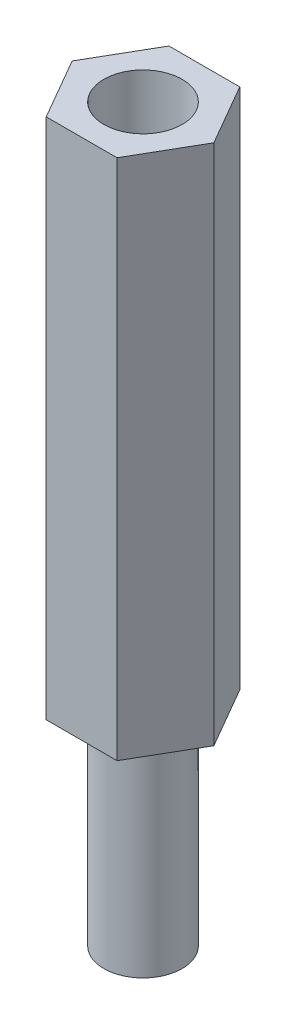
ISO-10303-21;
HEADER;
FILE_DESCRIPTION(('STEP AP214'),'2;1');
FILE_NAME('part.step','',(''),(''),'','','');
FILE_SCHEMA(('AUTOMOTIVE_DESIGN { 1 0 10303 214 1 1 1 1 }'));
ENDSEC;
DATA;
#1=APPLICATION_CONTEXT('core data for automotive mechanical design processes');
#2=APPLICATION_PROTOCOL_DEFINITION('international standard','automotive_design',2000,#1);
#3=PRODUCT_CONTEXT('',#1,'mechanical');
#4=PRODUCT('Part','Part','',(#3));
#5=PRODUCT_RELATED_PRODUCT_CATEGORY('part','',(#4));
#6=PRODUCT_DEFINITION_FORMATION('','',#4);
#7=PRODUCT_DEFINITION_CONTEXT('part definition',#1,'design');
#8=PRODUCT_DEFINITION('design','',#6,#7);
#9=PRODUCT_DEFINITION_SHAPE('','',#8);
#10=(LENGTH_UNIT() NAMED_UNIT(*) SI_UNIT(.MILLI.,.METRE.));
#11=(NAMED_UNIT(*) PLANE_ANGLE_UNIT() SI_UNIT($,.RADIAN.));
#12=(NAMED_UNIT(*) SI_UNIT($,.STERADIAN.) SOLID_ANGLE_UNIT());
#13=UNCERTAINTY_MEASURE_WITH_UNIT(LENGTH_MEASURE(1.E-05),#10,'distance_accuracy_value','');
#14=(GEOMETRIC_REPRESENTATION_CONTEXT(3) GLOBAL_UNCERTAINTY_ASSIGNED_CONTEXT((#13)) GLOBAL_UNIT_ASSIGNED_CONTEXT((#10,
#11,#12)) REPRESENTATION_CONTEXT('',''));
#15=CARTESIAN_POINT('',(0.,0.,0.));
#16=DIRECTION('',(0.,0.,1.));
#17=DIRECTION('',(1.,0.,0.));
#18=AXIS2_PLACEMENT_3D('',#15,#16,#17);
#19=CARTESIAN_POINT('',(0.,-8.,0.));
#20=DIRECTION('',(0.,1.,0.));
#21=DIRECTION('',(0.,0.,1.));
#22=AXIS2_PLACEMENT_3D('',#19,#20,#21);
#23=CYLINDRICAL_SURFACE('',#22,1.5);
#24=CARTESIAN_POINT('',(0.,-8.,0.));
#25=DIRECTION('',(0.,-1.,0.));
#26=DIRECTION('',(0.,0.,-1.));
#27=AXIS2_PLACEMENT_3D('',#24,#25,#26);
#28=CIRCLE('',#27,1.5);
#29=CARTESIAN_POINT('',(0.,-8.,-1.5));
#30=VERTEX_POINT('',#29);
#31=EDGE_CURVE('E11',#30,#30,#28,.T.);
#32=ORIENTED_EDGE('',*,*,#31,.F.);
#33=EDGE_LOOP('',(#32));
#34=FACE_BOUND('',#33,.T.);
#35=CARTESIAN_POINT('',(0.,0.,0.));
#36=DIRECTION('',(0.,-1.,0.));
#37=DIRECTION('',(0.,0.,-1.));
#38=AXIS2_PLACEMENT_3D('',#35,#36,#37);
#39=CIRCLE('',#38,1.5);
#40=CARTESIAN_POINT('',(0.,0.,-1.5));
#41=VERTEX_POINT('',#40);
#42=EDGE_CURVE('E46',#41,#41,#39,.T.);
#43=ORIENTED_EDGE('',*,*,#42,.T.);
#44=EDGE_LOOP('',(#43));
#45=FACE_BOUND('',#44,.T.);
#46=ADVANCED_FACE('F43',(#34,#45),#23,.T.);
#47=CARTESIAN_POINT('',(0.,-8.,0.));
#48=DIRECTION('',(0.,-1.,0.));
#49=DIRECTION('',(0.,0.,-1.));
#50=AXIS2_PLACEMENT_3D('',#47,#48,#49);
#51=PLANE('',#50);
#52=ORIENTED_EDGE('',*,*,#31,.T.);
#53=EDGE_LOOP('',(#52));
#54=FACE_BOUND('',#53,.T.);
#55=ADVANCED_FACE('F58',(#54),#51,.T.);
#56=CARTESIAN_POINT('',(0.,0.,0.));
#57=DIRECTION('',(0.,-1.,0.));
#58=DIRECTION('',(0.,0.,-1.));
#59=AXIS2_PLACEMENT_3D('',#56,#57,#58);
#60=PLANE('',#59);
#61=ORIENTED_EDGE('',*,*,#42,.F.);
#62=EDGE_LOOP('',(#61));
#63=FACE_BOUND('',#62,.T.);
#64=ADVANCED_FACE('F56',(#63),#60,.F.);
#65=CLOSED_SHELL('',(#46,#55,#64));
#66=MANIFOLD_SOLID_BREP('B2',#65);
#67=CARTESIAN_POINT('',(0.,20.,0.));
#68=DIRECTION('',(0.,1.,0.));
#69=DIRECTION('',(0.,0.,1.));
#70=AXIS2_PLACEMENT_3D('',#67,#68,#69);
#71=PLANE('',#70);
#72=DIRECTION('',(0.5,0.,-0.866025403784438));
#73=VECTOR('',#72,1.);
#74=CARTESIAN_POINT('',(1.35677313259562,20.,2.35));
#75=LINE('',#74,#73);
#76=CARTESIAN_POINT('',(1.35677313259562,20.,2.35));
#77=VERTEX_POINT('',#76);
#78=CARTESIAN_POINT('',(2.71354626519124,20.,0.));
#79=VERTEX_POINT('',#78);
#80=EDGE_CURVE('E180',#77,#79,#75,.T.);
#81=ORIENTED_EDGE('',*,*,#80,.T.);
#82=DIRECTION('',(-0.5,0.,-0.866025403784438));
#83=VECTOR('',#82,1.);
#84=CARTESIAN_POINT('',(2.71354626519124,20.,0.));
#85=LINE('',#84,#83);
#86=CARTESIAN_POINT('',(1.35677313259562,20.,-2.35));
#87=VERTEX_POINT('',#86);
#88=EDGE_CURVE('E138',#79,#87,#85,.T.);
#89=ORIENTED_EDGE('',*,*,#88,.T.);
#90=DIRECTION('',(-1.,0.,0.));
#91=VECTOR('',#90,1.);
#92=CARTESIAN_POINT('',(1.35677313259562,20.,-2.35));
#93=LINE('',#92,#91);
#94=CARTESIAN_POINT('',(-1.35677313259562,20.,-2.35));
#95=VERTEX_POINT('',#94);
#96=EDGE_CURVE('E151',#87,#95,#93,.T.);
#97=ORIENTED_EDGE('',*,*,#96,.T.);
#98=DIRECTION('',(-0.5,0.,0.866025403784439));
#99=VECTOR('',#98,1.);
#100=CARTESIAN_POINT('',(-1.35677313259562,20.,-2.35));
#101=LINE('',#100,#99);
#102=CARTESIAN_POINT('',(-2.71354626519124,20.,0.));
#103=VERTEX_POINT('',#102);
#104=EDGE_CURVE('E145',#95,#103,#101,.T.);
#105=ORIENTED_EDGE('',*,*,#104,.T.);
#106=DIRECTION('',(0.5,0.,0.866025403784438));
#107=VECTOR('',#106,1.);
#108=CARTESIAN_POINT('',(-2.71354626519124,20.,0.));
#109=LINE('',#108,#107);
#110=CARTESIAN_POINT('',(-1.35677313259562,20.,2.35));
#111=VERTEX_POINT('',#110);
#112=EDGE_CURVE('E149',#103,#111,#109,.T.);
#113=ORIENTED_EDGE('',*,*,#112,.T.);
#114=DIRECTION('',(1.,0.,0.));
#115=VECTOR('',#114,1.);
#116=CARTESIAN_POINT('',(-1.35677313259562,20.,2.35));
#117=LINE('',#116,#115);
#118=EDGE_CURVE('E101',#111,#77,#117,.T.);
#119=ORIENTED_EDGE('',*,*,#118,.T.);
#120=EDGE_LOOP('',(#81,#89,#97,#105,#113,#119));
#121=FACE_BOUND('',#120,.T.);
#122=CARTESIAN_POINT('',(0.,20.,0.));
#123=DIRECTION('',(0.,1.,0.));
#124=DIRECTION('',(0.,0.,1.));
#125=AXIS2_PLACEMENT_3D('',#122,#123,#124);
#126=CIRCLE('',#125,1.5);
#127=CARTESIAN_POINT('',(0.,20.,1.5));
#128=VERTEX_POINT('',#127);
#129=EDGE_CURVE('E173',#128,#128,#126,.T.);
#130=ORIENTED_EDGE('',*,*,#129,.F.);
#131=EDGE_LOOP('',(#130));
#132=FACE_BOUND('',#131,.T.);
#133=ADVANCED_FACE('F84',(#121,#132),#71,.T.);
#134=CARTESIAN_POINT('',(0.,0.,0.));
#135=DIRECTION('',(0.,1.,0.));
#136=DIRECTION('',(0.,0.,1.));
#137=AXIS2_PLACEMENT_3D('',#134,#135,#136);
#138=PLANE('',#137);
#139=DIRECTION('',(0.5,0.,-0.866025403784438));
#140=VECTOR('',#139,1.);
#141=CARTESIAN_POINT('',(1.35677313259562,0.,2.35));
#142=LINE('',#141,#140);
#143=CARTESIAN_POINT('',(1.35677313259562,0.,2.35));
#144=VERTEX_POINT('',#143);
#145=CARTESIAN_POINT('',(2.71354626519124,0.,0.));
#146=VERTEX_POINT('',#145);
#147=EDGE_CURVE('E169',#144,#146,#142,.T.);
#148=ORIENTED_EDGE('',*,*,#147,.F.);
#149=DIRECTION('',(1.,0.,0.));
#150=VECTOR('',#149,1.);
#151=CARTESIAN_POINT('',(-1.35677313259562,0.,2.35));
#152=LINE('',#151,#150);
#153=CARTESIAN_POINT('',(-1.35677313259562,0.,2.35));
#154=VERTEX_POINT('',#153);
#155=EDGE_CURVE('E130',#154,#144,#152,.T.);
#156=ORIENTED_EDGE('',*,*,#155,.F.);
#157=DIRECTION('',(0.5,0.,0.866025403784438));
#158=VECTOR('',#157,1.);
#159=CARTESIAN_POINT('',(-2.71354626519124,0.,0.));
#160=LINE('',#159,#158);
#161=CARTESIAN_POINT('',(-2.71354626519124,0.,0.));
#162=VERTEX_POINT('',#161);
#163=EDGE_CURVE('E124',#162,#154,#160,.T.);
#164=ORIENTED_EDGE('',*,*,#163,.F.);
#165=DIRECTION('',(-0.5,0.,0.866025403784439));
#166=VECTOR('',#165,1.);
#167=CARTESIAN_POINT('',(-1.35677313259562,0.,-2.35));
#168=LINE('',#167,#166);
#169=CARTESIAN_POINT('',(-1.35677313259562,0.,-2.35));
#170=VERTEX_POINT('',#169);
#171=EDGE_CURVE('E159',#170,#162,#168,.T.);
#172=ORIENTED_EDGE('',*,*,#171,.F.);
#173=DIRECTION('',(-1.,0.,0.));
#174=VECTOR('',#173,1.);
#175=CARTESIAN_POINT('',(1.35677313259562,0.,-2.35));
#176=LINE('',#175,#174);
#177=CARTESIAN_POINT('',(1.35677313259562,0.,-2.35));
#178=VERTEX_POINT('',#177);
#179=EDGE_CURVE('E175',#178,#170,#176,.T.);
#180=ORIENTED_EDGE('',*,*,#179,.F.);
#181=DIRECTION('',(-0.5,0.,-0.866025403784438));
#182=VECTOR('',#181,1.);
#183=CARTESIAN_POINT('',(2.71354626519124,0.,0.));
#184=LINE('',#183,#182);
#185=EDGE_CURVE('E172',#146,#178,#184,.T.);
#186=ORIENTED_EDGE('',*,*,#185,.F.);
#187=EDGE_LOOP('',(#148,#156,#164,#172,#180,#186));
#188=FACE_BOUND('',#187,.T.);
#189=CARTESIAN_POINT('',(0.,0.,0.));
#190=DIRECTION('',(0.,1.,0.));
#191=DIRECTION('',(0.,0.,1.));
#192=AXIS2_PLACEMENT_3D('',#189,#190,#191);
#193=CIRCLE('',#192,1.5);
#194=CARTESIAN_POINT('',(0.,0.,1.5));
#195=VERTEX_POINT('',#194);
#196=EDGE_CURVE('E273',#195,#195,#193,.T.);
#197=ORIENTED_EDGE('',*,*,#196,.T.);
#198=EDGE_LOOP('',(#197));
#199=FACE_BOUND('',#198,.T.);
#200=ADVANCED_FACE('F189',(#188,#199),#138,.F.);
#201=CARTESIAN_POINT('',(1.35677313259562,20.,2.35));
#202=DIRECTION('',(-0.866025403784439,0.,-0.5));
#203=DIRECTION('',(-0.5,0.,0.866025403784439));
#204=AXIS2_PLACEMENT_3D('',#201,#202,#203);
#205=PLANE('',#204);
#206=ORIENTED_EDGE('',*,*,#147,.T.);
#207=DIRECTION('',(0.,-1.,0.));
#208=VECTOR('',#207,1.);
#209=CARTESIAN_POINT('',(2.71354626519124,20.,0.));
#210=LINE('',#209,#208);
#211=EDGE_CURVE('E41',#79,#146,#210,.T.);
#212=ORIENTED_EDGE('',*,*,#211,.F.);
#213=ORIENTED_EDGE('',*,*,#80,.F.);
#214=DIRECTION('',(0.,-1.,0.));
#215=VECTOR('',#214,1.);
#216=CARTESIAN_POINT('',(1.35677313259562,20.,2.35));
#217=LINE('',#216,#215);
#218=EDGE_CURVE('E165',#77,#144,#217,.T.);
#219=ORIENTED_EDGE('',*,*,#218,.T.);
#220=EDGE_LOOP('',(#206,#212,#213,#219));
#221=FACE_BOUND('',#220,.T.);
#222=ADVANCED_FACE('F86',(#221),#205,.F.);
#223=CARTESIAN_POINT('',(2.71354626519124,20.,0.));
#224=DIRECTION('',(-0.866025403784438,0.,0.5));
#225=DIRECTION('',(0.5,0.,0.866025403784438));
#226=AXIS2_PLACEMENT_3D('',#223,#224,#225);
#227=PLANE('',#226);
#228=ORIENTED_EDGE('',*,*,#185,.T.);
#229=DIRECTION('',(0.,-1.,0.));
#230=VECTOR('',#229,1.);
#231=CARTESIAN_POINT('',(1.35677313259562,20.,-2.35));
#232=LINE('',#231,#230);
#233=EDGE_CURVE('E93',#87,#178,#232,.T.);
#234=ORIENTED_EDGE('',*,*,#233,.F.);
#235=ORIENTED_EDGE('',*,*,#88,.F.);
#236=ORIENTED_EDGE('',*,*,#211,.T.);
#237=EDGE_LOOP('',(#228,#234,#235,#236));
#238=FACE_BOUND('',#237,.T.);
#239=ADVANCED_FACE('F214',(#238),#227,.F.);
#240=CARTESIAN_POINT('',(1.35677313259562,20.,-2.35));
#241=DIRECTION('',(0.,0.,1.));
#242=DIRECTION('',(1.,0.,0.));
#243=AXIS2_PLACEMENT_3D('',#240,#241,#242);
#244=PLANE('',#243);
#245=ORIENTED_EDGE('',*,*,#179,.T.);
#246=DIRECTION('',(0.,-1.,0.));
#247=VECTOR('',#246,1.);
#248=CARTESIAN_POINT('',(-1.35677313259562,20.,-2.35));
#249=LINE('',#248,#247);
#250=EDGE_CURVE('E160',#95,#170,#249,.T.);
#251=ORIENTED_EDGE('',*,*,#250,.F.);
#252=ORIENTED_EDGE('',*,*,#96,.F.);
#253=ORIENTED_EDGE('',*,*,#233,.T.);
#254=EDGE_LOOP('',(#245,#251,#252,#253));
#255=FACE_BOUND('',#254,.T.);
#256=ADVANCED_FACE('F186',(#255),#244,.F.);
#257=CARTESIAN_POINT('',(-1.35677313259562,20.,-2.35));
#258=DIRECTION('',(0.866025403784439,0.,0.5));
#259=DIRECTION('',(0.5,0.,-0.866025403784439));
#260=AXIS2_PLACEMENT_3D('',#257,#258,#259);
#261=PLANE('',#260);
#262=ORIENTED_EDGE('',*,*,#171,.T.);
#263=DIRECTION('',(0.,-1.,0.));
#264=VECTOR('',#263,1.);
#265=CARTESIAN_POINT('',(-2.71354626519124,20.,0.));
#266=LINE('',#265,#264);
#267=EDGE_CURVE('E156',#103,#162,#266,.T.);
#268=ORIENTED_EDGE('',*,*,#267,.F.);
#269=ORIENTED_EDGE('',*,*,#104,.F.);
#270=ORIENTED_EDGE('',*,*,#250,.T.);
#271=EDGE_LOOP('',(#262,#268,#269,#270));
#272=FACE_BOUND('',#271,.T.);
#273=ADVANCED_FACE('F157',(#272),#261,.F.);
#274=CARTESIAN_POINT('',(-2.71354626519124,20.,0.));
#275=DIRECTION('',(0.866025403784439,0.,-0.5));
#276=DIRECTION('',(-0.5,0.,-0.866025403784439));
#277=AXIS2_PLACEMENT_3D('',#274,#275,#276);
#278=PLANE('',#277);
#279=ORIENTED_EDGE('',*,*,#163,.T.);
#280=DIRECTION('',(0.,-1.,0.));
#281=VECTOR('',#280,1.);
#282=CARTESIAN_POINT('',(-1.35677313259562,20.,2.35));
#283=LINE('',#282,#281);
#284=EDGE_CURVE('E161',#111,#154,#283,.T.);
#285=ORIENTED_EDGE('',*,*,#284,.F.);
#286=ORIENTED_EDGE('',*,*,#112,.F.);
#287=ORIENTED_EDGE('',*,*,#267,.T.);
#288=EDGE_LOOP('',(#279,#285,#286,#287));
#289=FACE_BOUND('',#288,.T.);
#290=ADVANCED_FACE('F163',(#289),#278,.F.);
#291=CARTESIAN_POINT('',(-1.35677313259562,20.,2.35));
#292=DIRECTION('',(0.,0.,-1.));
#293=DIRECTION('',(-1.,0.,0.));
#294=AXIS2_PLACEMENT_3D('',#291,#292,#293);
#295=PLANE('',#294);
#296=ORIENTED_EDGE('',*,*,#155,.T.);
#297=ORIENTED_EDGE('',*,*,#218,.F.);
#298=ORIENTED_EDGE('',*,*,#118,.F.);
#299=ORIENTED_EDGE('',*,*,#284,.T.);
#300=EDGE_LOOP('',(#296,#297,#298,#299));
#301=FACE_BOUND('',#300,.T.);
#302=ADVANCED_FACE('F194',(#301),#295,.F.);
#303=CARTESIAN_POINT('',(0.,20.,0.));
#304=DIRECTION('',(0.,-1.,0.));
#305=DIRECTION('',(0.,0.,-1.));
#306=AXIS2_PLACEMENT_3D('',#303,#304,#305);
#307=CYLINDRICAL_SURFACE('',#306,1.5);
#308=ORIENTED_EDGE('',*,*,#129,.T.);
#309=EDGE_LOOP('',(#308));
#310=FACE_BOUND('',#309,.T.);
#311=ORIENTED_EDGE('',*,*,#196,.F.);
#312=EDGE_LOOP('',(#311));
#313=FACE_BOUND('',#312,.T.);
#314=ADVANCED_FACE('F196',(#310,#313),#307,.F.);
#315=CLOSED_SHELL('',(#133,#200,#222,#239,#256,#273,#290,#302,#314));
#316=MANIFOLD_SOLID_BREP('B6',#315);
#317=ADVANCED_BREP_SHAPE_REPRESENTATION('',(#18,#66,#316),#14);
#318=SHAPE_DEFINITION_REPRESENTATION(#9,#317);
ENDSEC;
END-ISO-10303-21;
